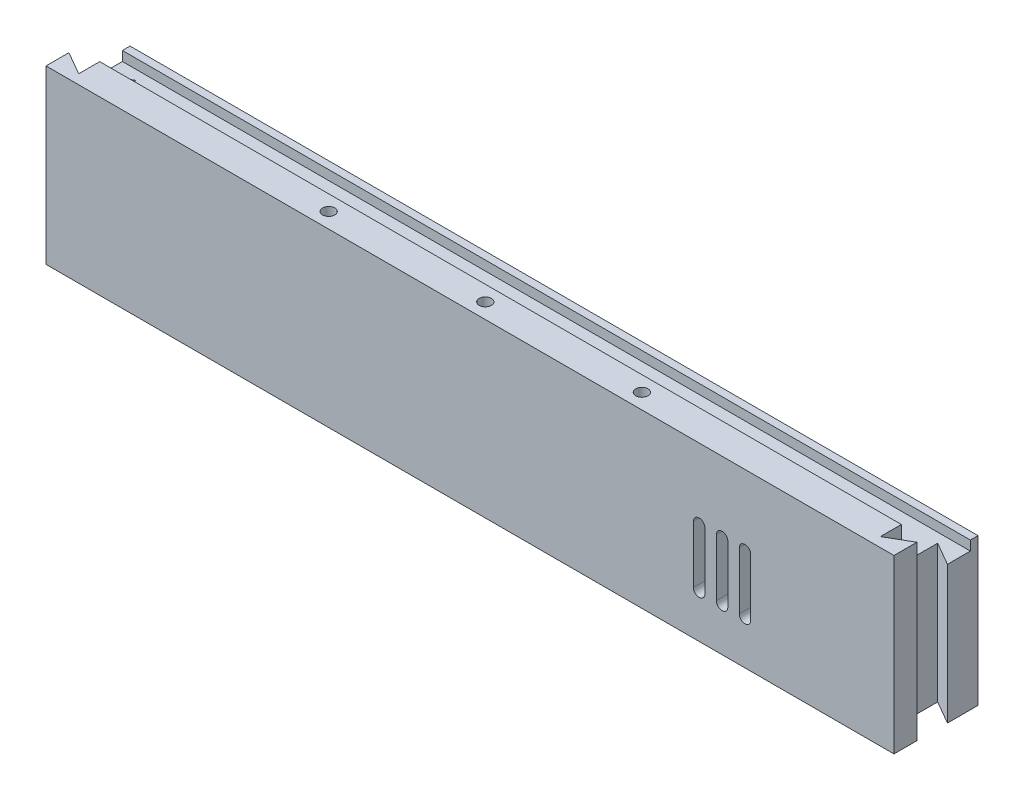
ISO-10303-21;
HEADER;
FILE_DESCRIPTION(('STEP AP214'),'2;1');
FILE_NAME('part.step','',(''),(''),'','','');
FILE_SCHEMA(('AUTOMOTIVE_DESIGN { 1 0 10303 214 1 1 1 1 }'));
ENDSEC;
DATA;
#1=APPLICATION_CONTEXT('core data for automotive mechanical design processes');
#2=APPLICATION_PROTOCOL_DEFINITION('international standard','automotive_design',2000,#1);
#3=PRODUCT_CONTEXT('',#1,'mechanical');
#4=PRODUCT('Part','Part','',(#3));
#5=PRODUCT_RELATED_PRODUCT_CATEGORY('part','',(#4));
#6=PRODUCT_DEFINITION_FORMATION('','',#4);
#7=PRODUCT_DEFINITION_CONTEXT('part definition',#1,'design');
#8=PRODUCT_DEFINITION('design','',#6,#7);
#9=PRODUCT_DEFINITION_SHAPE('','',#8);
#10=(LENGTH_UNIT() NAMED_UNIT(*) SI_UNIT(.MILLI.,.METRE.));
#11=(NAMED_UNIT(*) PLANE_ANGLE_UNIT() SI_UNIT($,.RADIAN.));
#12=(NAMED_UNIT(*) SI_UNIT($,.STERADIAN.) SOLID_ANGLE_UNIT());
#13=UNCERTAINTY_MEASURE_WITH_UNIT(LENGTH_MEASURE(1.E-05),#10,'distance_accuracy_value','');
#14=(GEOMETRIC_REPRESENTATION_CONTEXT(3) GLOBAL_UNCERTAINTY_ASSIGNED_CONTEXT((#13)) GLOBAL_UNIT_ASSIGNED_CONTEXT((#10,
#11,#12)) REPRESENTATION_CONTEXT('',''));
#15=CARTESIAN_POINT('',(0.,0.,0.));
#16=DIRECTION('',(0.,0.,1.));
#17=DIRECTION('',(1.,0.,0.));
#18=AXIS2_PLACEMENT_3D('',#15,#16,#17);
#19=CARTESIAN_POINT('',(0.,0.,0.));
#20=DIRECTION('',(0.,1.,0.));
#21=DIRECTION('',(0.,0.,1.));
#22=AXIS2_PLACEMENT_3D('',#19,#20,#21);
#23=PLANE('',#22);
#24=CARTESIAN_POINT('',(125.,0.,4.));
#25=DIRECTION('',(0.,1.,0.));
#26=DIRECTION('',(0.,0.,1.));
#27=AXIS2_PLACEMENT_3D('',#24,#25,#26);
#28=CIRCLE('',#27,1.59999999999999);
#29=CARTESIAN_POINT('',(125.,0.,5.59999999999999));
#30=VERTEX_POINT('',#29);
#31=EDGE_CURVE('E319',#30,#30,#28,.T.);
#32=ORIENTED_EDGE('',*,*,#31,.T.);
#33=EDGE_LOOP('',(#32));
#34=FACE_BOUND('',#33,.T.);
#35=DIRECTION('',(-1.,0.,0.));
#36=VECTOR('',#35,1.);
#37=CARTESIAN_POINT('',(14.,0.,-14.));
#38=LINE('',#37,#36);
#39=CARTESIAN_POINT('',(176.,0.,-14.));
#40=VERTEX_POINT('',#39);
#41=CARTESIAN_POINT('',(14.,0.,-14.));
#42=VERTEX_POINT('',#41);
#43=EDGE_CURVE('E556',#40,#42,#38,.T.);
#44=ORIENTED_EDGE('',*,*,#43,.F.);
#45=DIRECTION('',(0.,0.,-1.));
#46=VECTOR('',#45,1.);
#47=CARTESIAN_POINT('',(176.,0.,-8.));
#48=LINE('',#47,#46);
#49=CARTESIAN_POINT('',(176.,0.,-8.));
#50=VERTEX_POINT('',#49);
#51=EDGE_CURVE('E392',#50,#40,#48,.T.);
#52=ORIENTED_EDGE('',*,*,#51,.F.);
#53=DIRECTION('',(-1.,0.,0.));
#54=VECTOR('',#53,1.);
#55=CARTESIAN_POINT('',(206.,0.,-8.));
#56=LINE('',#55,#54);
#57=CARTESIAN_POINT('',(206.,0.,-8.));
#58=VERTEX_POINT('',#57);
#59=EDGE_CURVE('E407',#58,#50,#56,.T.);
#60=ORIENTED_EDGE('',*,*,#59,.F.);
#61=DIRECTION('',(0.,0.,1.));
#62=VECTOR('',#61,1.);
#63=CARTESIAN_POINT('',(206.,0.,-14.));
#64=LINE('',#63,#62);
#65=CARTESIAN_POINT('',(206.,0.,-14.));
#66=VERTEX_POINT('',#65);
#67=EDGE_CURVE('E386',#66,#58,#64,.T.);
#68=ORIENTED_EDGE('',*,*,#67,.F.);
#69=CARTESIAN_POINT('',(236.,0.,-14.));
#70=VERTEX_POINT('',#69);
#71=EDGE_CURVE('E557',#70,#66,#38,.T.);
#72=ORIENTED_EDGE('',*,*,#71,.F.);
#73=DIRECTION('',(0.,0.,1.));
#74=VECTOR('',#73,1.);
#75=CARTESIAN_POINT('',(236.,0.,0.));
#76=LINE('',#75,#74);
#77=CARTESIAN_POINT('',(236.,0.,-6.00000000000012));
#78=VERTEX_POINT('',#77);
#79=EDGE_CURVE('E456',#70,#78,#76,.T.);
#80=ORIENTED_EDGE('',*,*,#79,.T.);
#81=DIRECTION('',(0.866025403784441,0.,0.499999999999996));
#82=VECTOR('',#81,1.);
#83=CARTESIAN_POINT('',(61.5980762113523,0.,-106.690997646563));
#84=LINE('',#83,#82);
#85=CARTESIAN_POINT('',(229.937822173509,0.,-9.5000000000001));
#86=VERTEX_POINT('',#85);
#87=EDGE_CURVE('E486',#86,#78,#84,.T.);
#88=ORIENTED_EDGE('',*,*,#87,.F.);
#89=DIRECTION('',(0.,0.,-1.));
#90=VECTOR('',#89,1.);
#91=CARTESIAN_POINT('',(229.937822173509,0.,-4.25470440681991E-13));
#92=LINE('',#91,#90);
#93=CARTESIAN_POINT('',(229.937822173509,0.,5.49999999999989));
#94=VERTEX_POINT('',#93);
#95=EDGE_CURVE('E482',#94,#86,#92,.T.);
#96=ORIENTED_EDGE('',*,*,#95,.F.);
#97=DIRECTION('',(-0.866025403784439,0.,0.499999999999999));
#98=VECTOR('',#97,1.);
#99=CARTESIAN_POINT('',(59.8660254037842,0.,103.690997646564));
#100=LINE('',#99,#98);
#101=CARTESIAN_POINT('',(236.,0.,1.99999999999989));
#102=VERTEX_POINT('',#101);
#103=EDGE_CURVE('E478',#102,#94,#100,.T.);
#104=ORIENTED_EDGE('',*,*,#103,.F.);
#105=CARTESIAN_POINT('',(236.,0.,8.));
#106=VERTEX_POINT('',#105);
#107=EDGE_CURVE('E461',#102,#106,#76,.T.);
#108=ORIENTED_EDGE('',*,*,#107,.T.);
#109=DIRECTION('',(-1.,0.,0.));
#110=VECTOR('',#109,1.);
#111=CARTESIAN_POINT('',(0.,0.,7.99999999999999));
#112=LINE('',#111,#110);
#113=CARTESIAN_POINT('',(14.,0.,7.99999999999999));
#114=VERTEX_POINT('',#113);
#115=EDGE_CURVE('E448',#106,#114,#112,.T.);
#116=ORIENTED_EDGE('',*,*,#115,.T.);
#117=DIRECTION('',(0.,0.,1.));
#118=VECTOR('',#117,1.);
#119=CARTESIAN_POINT('',(14.,0.,0.));
#120=LINE('',#119,#118);
#121=CARTESIAN_POINT('',(14.,0.,2.));
#122=VERTEX_POINT('',#121);
#123=EDGE_CURVE('E466',#122,#114,#120,.T.);
#124=ORIENTED_EDGE('',*,*,#123,.F.);
#125=DIRECTION('',(0.86602540378444,0.,0.499999999999998));
#126=VECTOR('',#125,1.);
#127=CARTESIAN_POINT('',(2.63397459621554,0.,-4.56217782649105));
#128=LINE('',#127,#126);
#129=CARTESIAN_POINT('',(20.0621778264911,0.,5.5));
#130=VERTEX_POINT('',#129);
#131=EDGE_CURVE('E474',#122,#130,#128,.T.);
#132=ORIENTED_EDGE('',*,*,#131,.T.);
#133=DIRECTION('',(0.,0.,-1.));
#134=VECTOR('',#133,1.);
#135=CARTESIAN_POINT('',(20.0621778264911,0.,0.));
#136=LINE('',#135,#134);
#137=CARTESIAN_POINT('',(20.0621778264911,0.,-9.5));
#138=VERTEX_POINT('',#137);
#139=EDGE_CURVE('E470',#130,#138,#136,.T.);
#140=ORIENTED_EDGE('',*,*,#139,.T.);
#141=DIRECTION('',(-0.86602540378444,0.,0.499999999999997));
#142=VECTOR('',#141,1.);
#143=CARTESIAN_POINT('',(0.901923788646657,0.,1.56217782649103));
#144=LINE('',#143,#142);
#145=CARTESIAN_POINT('',(14.,0.,-6.));
#146=VERTEX_POINT('',#145);
#147=EDGE_CURVE('E465',#138,#146,#144,.T.);
#148=ORIENTED_EDGE('',*,*,#147,.T.);
#149=EDGE_CURVE('E460',#42,#146,#120,.T.);
#150=ORIENTED_EDGE('',*,*,#149,.F.);
#151=EDGE_LOOP('',(#44,#52,#60,#68,#72,#80,#88,#96,#104,#108,#116,#124,#132,#140,#148,#150));
#152=FACE_BOUND('',#151,.T.);
#153=CARTESIAN_POINT('',(84.,0.,4.));
#154=DIRECTION('',(0.,1.,0.));
#155=DIRECTION('',(0.,0.,1.));
#156=AXIS2_PLACEMENT_3D('',#153,#154,#155);
#157=CIRCLE('',#156,1.59999999999999);
#158=CARTESIAN_POINT('',(84.,0.,5.59999999999999));
#159=VERTEX_POINT('',#158);
#160=EDGE_CURVE('E430',#159,#159,#157,.F.);
#161=ORIENTED_EDGE('',*,*,#160,.F.);
#162=EDGE_LOOP('',(#161));
#163=FACE_BOUND('',#162,.T.);
#164=CARTESIAN_POINT('',(166.,0.,4.));
#165=DIRECTION('',(0.,1.,0.));
#166=DIRECTION('',(0.,0.,1.));
#167=AXIS2_PLACEMENT_3D('',#164,#165,#166);
#168=CIRCLE('',#167,1.59999999999999);
#169=CARTESIAN_POINT('',(166.,0.,5.59999999999999));
#170=VERTEX_POINT('',#169);
#171=EDGE_CURVE('E437',#170,#170,#168,.T.);
#172=ORIENTED_EDGE('',*,*,#171,.T.);
#173=EDGE_LOOP('',(#172));
#174=FACE_BOUND('',#173,.T.);
#175=ADVANCED_FACE('F40',(#34,#152,#163,#174),#23,.F.);
#176=CARTESIAN_POINT('',(0.,45.,0.));
#177=DIRECTION('',(0.,1.,0.));
#178=DIRECTION('',(0.,0.,1.));
#179=AXIS2_PLACEMENT_3D('',#176,#177,#178);
#180=PLANE('',#179);
#181=CARTESIAN_POINT('',(125.,45.,4.));
#182=DIRECTION('',(0.,1.,0.));
#183=DIRECTION('',(0.,0.,1.));
#184=AXIS2_PLACEMENT_3D('',#181,#182,#183);
#185=CIRCLE('',#184,1.59999999999999);
#186=CARTESIAN_POINT('',(125.,45.,5.59999999999999));
#187=VERTEX_POINT('',#186);
#188=EDGE_CURVE('E1031',#187,#187,#185,.T.);
#189=ORIENTED_EDGE('',*,*,#188,.F.);
#190=EDGE_LOOP('',(#189));
#191=FACE_BOUND('',#190,.T.);
#192=CARTESIAN_POINT('',(84.,45.,4.));
#193=DIRECTION('',(0.,1.,0.));
#194=DIRECTION('',(0.,0.,1.));
#195=AXIS2_PLACEMENT_3D('',#192,#193,#194);
#196=CIRCLE('',#195,1.59999999999999);
#197=CARTESIAN_POINT('',(84.,45.,5.59999999999999));
#198=VERTEX_POINT('',#197);
#199=EDGE_CURVE('E417',#198,#198,#196,.F.);
#200=ORIENTED_EDGE('',*,*,#199,.T.);
#201=EDGE_LOOP('',(#200));
#202=FACE_BOUND('',#201,.T.);
#203=DIRECTION('',(-1.,0.,0.));
#204=VECTOR('',#203,1.);
#205=CARTESIAN_POINT('',(0.,45.,7.99999999999999));
#206=LINE('',#205,#204);
#207=CARTESIAN_POINT('',(236.,45.,7.99999999999999));
#208=VERTEX_POINT('',#207);
#209=CARTESIAN_POINT('',(14.,45.,7.99999999999999));
#210=VERTEX_POINT('',#209);
#211=EDGE_CURVE('E441',#208,#210,#206,.T.);
#212=ORIENTED_EDGE('',*,*,#211,.F.);
#213=DIRECTION('',(0.,0.,-1.));
#214=VECTOR('',#213,1.);
#215=CARTESIAN_POINT('',(236.,45.,0.));
#216=LINE('',#215,#214);
#217=CARTESIAN_POINT('',(236.,45.,1.99999999999989));
#218=VERTEX_POINT('',#217);
#219=EDGE_CURVE('E545',#208,#218,#216,.T.);
#220=ORIENTED_EDGE('',*,*,#219,.T.);
#221=DIRECTION('',(0.866025403784439,0.,-0.499999999999999));
#222=VECTOR('',#221,1.);
#223=CARTESIAN_POINT('',(59.8660254037842,45.,103.690997646564));
#224=LINE('',#223,#222);
#225=CARTESIAN_POINT('',(229.937822173509,45.,5.49999999999989));
#226=VERTEX_POINT('',#225);
#227=EDGE_CURVE('E552',#226,#218,#224,.T.);
#228=ORIENTED_EDGE('',*,*,#227,.F.);
#229=DIRECTION('',(0.,0.,1.));
#230=VECTOR('',#229,1.);
#231=CARTESIAN_POINT('',(229.937822173509,45.,-4.25470440681991E-13));
#232=LINE('',#231,#230);
#233=CARTESIAN_POINT('',(229.937822173509,45.,0.));
#234=VERTEX_POINT('',#233);
#235=EDGE_CURVE('E532',#234,#226,#232,.T.);
#236=ORIENTED_EDGE('',*,*,#235,.F.);
#237=DIRECTION('',(1.,0.,0.));
#238=VECTOR('',#237,1.);
#239=CARTESIAN_POINT('',(0.,45.,0.));
#240=LINE('',#239,#238);
#241=CARTESIAN_POINT('',(20.0621778264911,45.,0.));
#242=VERTEX_POINT('',#241);
#243=EDGE_CURVE('E577',#242,#234,#240,.T.);
#244=ORIENTED_EDGE('',*,*,#243,.F.);
#245=DIRECTION('',(0.,0.,1.));
#246=VECTOR('',#245,1.);
#247=CARTESIAN_POINT('',(20.0621778264911,45.,0.));
#248=LINE('',#247,#246);
#249=CARTESIAN_POINT('',(20.0621778264911,45.,5.5));
#250=VERTEX_POINT('',#249);
#251=EDGE_CURVE('E525',#242,#250,#248,.T.);
#252=ORIENTED_EDGE('',*,*,#251,.T.);
#253=DIRECTION('',(-0.86602540378444,0.,-0.499999999999998));
#254=VECTOR('',#253,1.);
#255=CARTESIAN_POINT('',(2.63397459621554,45.,-4.56217782649105));
#256=LINE('',#255,#254);
#257=CARTESIAN_POINT('',(14.,45.,2.));
#258=VERTEX_POINT('',#257);
#259=EDGE_CURVE('E548',#250,#258,#256,.T.);
#260=ORIENTED_EDGE('',*,*,#259,.T.);
#261=DIRECTION('',(0.,0.,-1.));
#262=VECTOR('',#261,1.);
#263=CARTESIAN_POINT('',(14.,45.,0.));
#264=LINE('',#263,#262);
#265=EDGE_CURVE('E542',#210,#258,#264,.T.);
#266=ORIENTED_EDGE('',*,*,#265,.F.);
#267=EDGE_LOOP('',(#212,#220,#228,#236,#244,#252,#260,#266));
#268=FACE_BOUND('',#267,.T.);
#269=CARTESIAN_POINT('',(166.,45.,4.));
#270=DIRECTION('',(0.,1.,0.));
#271=DIRECTION('',(0.,0.,1.));
#272=AXIS2_PLACEMENT_3D('',#269,#270,#271);
#273=CIRCLE('',#272,1.59999999999999);
#274=CARTESIAN_POINT('',(166.,45.,5.59999999999999));
#275=VERTEX_POINT('',#274);
#276=EDGE_CURVE('E426',#275,#275,#273,.T.);
#277=ORIENTED_EDGE('',*,*,#276,.F.);
#278=EDGE_LOOP('',(#277));
#279=FACE_BOUND('',#278,.T.);
#280=ADVANCED_FACE('F674',(#191,#202,#268,#279),#180,.T.);
#281=CARTESIAN_POINT('',(0.,38.5,0.));
#282=DIRECTION('',(0.,-1.,0.));
#283=DIRECTION('',(0.,0.,-1.));
#284=AXIS2_PLACEMENT_3D('',#281,#282,#283);
#285=PLANE('',#284);
#286=DIRECTION('',(0.,0.,1.));
#287=VECTOR('',#286,1.);
#288=CARTESIAN_POINT('',(236.,38.5,0.));
#289=LINE('',#288,#287);
#290=CARTESIAN_POINT('',(236.,38.5,-14.));
#291=VERTEX_POINT('',#290);
#292=CARTESIAN_POINT('',(236.,38.5,-12.));
#293=VERTEX_POINT('',#292);
#294=EDGE_CURVE('E539',#291,#293,#289,.T.);
#295=ORIENTED_EDGE('',*,*,#294,.F.);
#296=DIRECTION('',(1.,0.,0.));
#297=VECTOR('',#296,1.);
#298=CARTESIAN_POINT('',(14.,38.5,-14.));
#299=LINE('',#298,#297);
#300=CARTESIAN_POINT('',(14.,38.5,-14.));
#301=VERTEX_POINT('',#300);
#302=EDGE_CURVE('E566',#301,#291,#299,.T.);
#303=ORIENTED_EDGE('',*,*,#302,.F.);
#304=DIRECTION('',(0.,0.,1.));
#305=VECTOR('',#304,1.);
#306=CARTESIAN_POINT('',(14.,38.5,0.));
#307=LINE('',#306,#305);
#308=CARTESIAN_POINT('',(14.,38.5,-12.));
#309=VERTEX_POINT('',#308);
#310=EDGE_CURVE('E517',#301,#309,#307,.T.);
#311=ORIENTED_EDGE('',*,*,#310,.T.);
#312=DIRECTION('',(1.,0.,0.));
#313=VECTOR('',#312,1.);
#314=CARTESIAN_POINT('',(0.,38.5,-12.));
#315=LINE('',#314,#313);
#316=EDGE_CURVE('E561',#309,#293,#315,.T.);
#317=ORIENTED_EDGE('',*,*,#316,.T.);
#318=EDGE_LOOP('',(#295,#303,#311,#317));
#319=FACE_BOUND('',#318,.T.);
#320=ADVANCED_FACE('F622',(#319),#285,.F.);
#321=CARTESIAN_POINT('',(0.,45.,0.));
#322=DIRECTION('',(0.,0.,-1.));
#323=DIRECTION('',(-1.,0.,0.));
#324=AXIS2_PLACEMENT_3D('',#321,#322,#323);
#325=PLANE('',#324);
#326=DIRECTION('',(0.,1.,0.));
#327=VECTOR('',#326,1.);
#328=CARTESIAN_POINT('',(229.937822173509,45.,0.));
#329=LINE('',#328,#327);
#330=CARTESIAN_POINT('',(229.937822173509,36.,0.));
#331=VERTEX_POINT('',#330);
#332=EDGE_CURVE('E529',#331,#234,#329,.T.);
#333=ORIENTED_EDGE('',*,*,#332,.F.);
#334=DIRECTION('',(1.,0.,0.));
#335=VECTOR('',#334,1.);
#336=CARTESIAN_POINT('',(20.0621778264911,36.,0.));
#337=LINE('',#336,#335);
#338=CARTESIAN_POINT('',(20.0621778264911,36.,0.));
#339=VERTEX_POINT('',#338);
#340=EDGE_CURVE('E452',#339,#331,#337,.T.);
#341=ORIENTED_EDGE('',*,*,#340,.F.);
#342=DIRECTION('',(0.,1.,0.));
#343=VECTOR('',#342,1.);
#344=CARTESIAN_POINT('',(20.0621778264911,45.,0.));
#345=LINE('',#344,#343);
#346=EDGE_CURVE('E521',#339,#242,#345,.T.);
#347=ORIENTED_EDGE('',*,*,#346,.T.);
#348=ORIENTED_EDGE('',*,*,#243,.T.);
#349=EDGE_LOOP('',(#333,#341,#347,#348));
#350=FACE_BOUND('',#349,.T.);
#351=ADVANCED_FACE('F42',(#350),#325,.T.);
#352=CARTESIAN_POINT('',(0.,36.,-12.));
#353=DIRECTION('',(0.,0.,1.));
#354=DIRECTION('',(1.,0.,0.));
#355=AXIS2_PLACEMENT_3D('',#352,#353,#354);
#356=PLANE('',#355);
#357=DIRECTION('',(1.,0.,0.));
#358=VECTOR('',#357,1.);
#359=CARTESIAN_POINT('',(0.,36.,-12.));
#360=LINE('',#359,#358);
#361=CARTESIAN_POINT('',(14.,36.,-12.));
#362=VERTEX_POINT('',#361);
#363=CARTESIAN_POINT('',(236.,36.,-12.));
#364=VERTEX_POINT('',#363);
#365=EDGE_CURVE('E562',#362,#364,#360,.T.);
#366=ORIENTED_EDGE('',*,*,#365,.T.);
#367=DIRECTION('',(0.,1.,0.));
#368=VECTOR('',#367,1.);
#369=CARTESIAN_POINT('',(236.,36.,-12.));
#370=LINE('',#369,#368);
#371=EDGE_CURVE('E535',#364,#293,#370,.T.);
#372=ORIENTED_EDGE('',*,*,#371,.T.);
#373=ORIENTED_EDGE('',*,*,#316,.F.);
#374=DIRECTION('',(0.,1.,0.));
#375=VECTOR('',#374,1.);
#376=CARTESIAN_POINT('',(14.,36.,-12.));
#377=LINE('',#376,#375);
#378=EDGE_CURVE('E494',#362,#309,#377,.T.);
#379=ORIENTED_EDGE('',*,*,#378,.F.);
#380=EDGE_LOOP('',(#366,#372,#373,#379));
#381=FACE_BOUND('',#380,.T.);
#382=ADVANCED_FACE('F614',(#381),#356,.T.);
#383=CARTESIAN_POINT('',(0.,36.,0.));
#384=DIRECTION('',(0.,1.,0.));
#385=DIRECTION('',(0.,0.,1.));
#386=AXIS2_PLACEMENT_3D('',#383,#384,#385);
#387=PLANE('',#386);
#388=DIRECTION('',(-0.866025403784441,0.,-0.499999999999996));
#389=VECTOR('',#388,1.);
#390=CARTESIAN_POINT('',(61.5980762113523,36.,-106.690997646563));
#391=LINE('',#390,#389);
#392=CARTESIAN_POINT('',(236.,36.,-6.00000000000012));
#393=VERTEX_POINT('',#392);
#394=CARTESIAN_POINT('',(229.937822173509,36.,-9.5000000000001));
#395=VERTEX_POINT('',#394);
#396=EDGE_CURVE('E599',#393,#395,#391,.T.);
#397=ORIENTED_EDGE('',*,*,#396,.F.);
#398=DIRECTION('',(0.,0.,-1.));
#399=VECTOR('',#398,1.);
#400=CARTESIAN_POINT('',(236.,36.,0.));
#401=LINE('',#400,#399);
#402=EDGE_CURVE('E49',#393,#364,#401,.T.);
#403=ORIENTED_EDGE('',*,*,#402,.T.);
#404=ORIENTED_EDGE('',*,*,#365,.F.);
#405=DIRECTION('',(0.,0.,-1.));
#406=VECTOR('',#405,1.);
#407=CARTESIAN_POINT('',(14.,36.,0.));
#408=LINE('',#407,#406);
#409=CARTESIAN_POINT('',(14.,36.,-6.));
#410=VERTEX_POINT('',#409);
#411=EDGE_CURVE('E584',#410,#362,#408,.T.);
#412=ORIENTED_EDGE('',*,*,#411,.F.);
#413=DIRECTION('',(0.86602540378444,0.,-0.499999999999997));
#414=VECTOR('',#413,1.);
#415=CARTESIAN_POINT('',(0.901923788646657,36.,1.56217782649103));
#416=LINE('',#415,#414);
#417=CARTESIAN_POINT('',(20.0621778264911,36.,-9.5));
#418=VERTEX_POINT('',#417);
#419=EDGE_CURVE('E587',#410,#418,#416,.T.);
#420=ORIENTED_EDGE('',*,*,#419,.T.);
#421=DIRECTION('',(0.,0.,1.));
#422=VECTOR('',#421,1.);
#423=CARTESIAN_POINT('',(20.0621778264911,36.,0.));
#424=LINE('',#423,#422);
#425=EDGE_CURVE('E591',#418,#339,#424,.T.);
#426=ORIENTED_EDGE('',*,*,#425,.T.);
#427=ORIENTED_EDGE('',*,*,#340,.T.);
#428=DIRECTION('',(0.,0.,1.));
#429=VECTOR('',#428,1.);
#430=CARTESIAN_POINT('',(229.937822173509,36.,-4.25470440681991E-13));
#431=LINE('',#430,#429);
#432=EDGE_CURVE('E595',#395,#331,#431,.T.);
#433=ORIENTED_EDGE('',*,*,#432,.F.);
#434=EDGE_LOOP('',(#397,#403,#404,#412,#420,#426,#427,#433));
#435=FACE_BOUND('',#434,.T.);
#436=ADVANCED_FACE('F607',(#435),#387,.T.);
#437=CARTESIAN_POINT('',(14.,33.5,-14.));
#438=DIRECTION('',(0.,0.,1.));
#439=DIRECTION('',(1.,0.,0.));
#440=AXIS2_PLACEMENT_3D('',#437,#438,#439);
#441=PLANE('',#440);
#442=DIRECTION('',(1.,0.,0.));
#443=VECTOR('',#442,1.);
#444=CARTESIAN_POINT('',(206.,30.,-14.));
#445=LINE('',#444,#443);
#446=CARTESIAN_POINT('',(176.,30.,-14.));
#447=VERTEX_POINT('',#446);
#448=CARTESIAN_POINT('',(206.,30.,-14.));
#449=VERTEX_POINT('',#448);
#450=EDGE_CURVE('E387',#447,#449,#445,.T.);
#451=ORIENTED_EDGE('',*,*,#450,.F.);
#452=DIRECTION('',(0.,-1.,0.));
#453=VECTOR('',#452,1.);
#454=CARTESIAN_POINT('',(176.,30.,-14.));
#455=LINE('',#454,#453);
#456=EDGE_CURVE('E413',#447,#40,#455,.T.);
#457=ORIENTED_EDGE('',*,*,#456,.T.);
#458=ORIENTED_EDGE('',*,*,#43,.T.);
#459=DIRECTION('',(0.,1.,0.));
#460=VECTOR('',#459,1.);
#461=CARTESIAN_POINT('',(14.,33.5,-14.));
#462=LINE('',#461,#460);
#463=EDGE_CURVE('E573',#42,#301,#462,.T.);
#464=ORIENTED_EDGE('',*,*,#463,.T.);
#465=ORIENTED_EDGE('',*,*,#302,.T.);
#466=DIRECTION('',(0.,1.,0.));
#467=VECTOR('',#466,1.);
#468=CARTESIAN_POINT('',(236.,33.5,-14.));
#469=LINE('',#468,#467);
#470=EDGE_CURVE('E574',#70,#291,#469,.T.);
#471=ORIENTED_EDGE('',*,*,#470,.F.);
#472=ORIENTED_EDGE('',*,*,#71,.T.);
#473=DIRECTION('',(0.,-1.,0.));
#474=VECTOR('',#473,1.);
#475=CARTESIAN_POINT('',(206.,30.,-14.));
#476=LINE('',#475,#474);
#477=EDGE_CURVE('E403',#449,#66,#476,.T.);
#478=ORIENTED_EDGE('',*,*,#477,.F.);
#479=EDGE_LOOP('',(#451,#457,#458,#464,#465,#471,#472,#478));
#480=FACE_BOUND('',#479,.T.);
#481=ADVANCED_FACE('F626',(#480),#441,.F.);
#482=CARTESIAN_POINT('',(14.,126.5,0.));
#483=DIRECTION('',(1.,0.,0.));
#484=DIRECTION('',(0.,0.,-1.));
#485=AXIS2_PLACEMENT_3D('',#482,#483,#484);
#486=PLANE('',#485);
#487=ORIENTED_EDGE('',*,*,#123,.T.);
#488=DIRECTION('',(0.,1.,0.));
#489=VECTOR('',#488,1.);
#490=CARTESIAN_POINT('',(14.,-15.5,7.99999999999999));
#491=LINE('',#490,#489);
#492=EDGE_CURVE('E444',#114,#210,#491,.T.);
#493=ORIENTED_EDGE('',*,*,#492,.T.);
#494=ORIENTED_EDGE('',*,*,#265,.T.);
#495=DIRECTION('',(0.,-1.,0.));
#496=VECTOR('',#495,1.);
#497=CARTESIAN_POINT('',(14.,126.5,2.));
#498=LINE('',#497,#496);
#499=EDGE_CURVE('E504',#258,#122,#498,.T.);
#500=ORIENTED_EDGE('',*,*,#499,.T.);
#501=EDGE_LOOP('',(#487,#493,#494,#500));
#502=FACE_BOUND('',#501,.T.);
#503=ADVANCED_FACE('F688',(#502),#486,.F.);
#504=ORIENTED_EDGE('',*,*,#149,.T.);
#505=DIRECTION('',(0.,-1.,0.));
#506=VECTOR('',#505,1.);
#507=CARTESIAN_POINT('',(14.,126.5,-6.));
#508=LINE('',#507,#506);
#509=EDGE_CURVE('E490',#410,#146,#508,.T.);
#510=ORIENTED_EDGE('',*,*,#509,.F.);
#511=ORIENTED_EDGE('',*,*,#411,.T.);
#512=ORIENTED_EDGE('',*,*,#378,.T.);
#513=ORIENTED_EDGE('',*,*,#310,.F.);
#514=ORIENTED_EDGE('',*,*,#463,.F.);
#515=EDGE_LOOP('',(#504,#510,#511,#512,#513,#514));
#516=FACE_BOUND('',#515,.T.);
#517=ADVANCED_FACE('F617',(#516),#486,.F.);
#518=CARTESIAN_POINT('',(0.901923788646657,126.5,1.56217782649103));
#519=DIRECTION('',(0.499999999999997,0.,0.86602540378444));
#520=DIRECTION('',(0.86602540378444,0.,-0.499999999999997));
#521=AXIS2_PLACEMENT_3D('',#518,#519,#520);
#522=PLANE('',#521);
#523=ORIENTED_EDGE('',*,*,#509,.T.);
#524=ORIENTED_EDGE('',*,*,#147,.F.);
#525=DIRECTION('',(0.,-1.,0.));
#526=VECTOR('',#525,1.);
#527=CARTESIAN_POINT('',(20.0621778264911,126.5,-9.5));
#528=LINE('',#527,#526);
#529=EDGE_CURVE('E510',#418,#138,#528,.T.);
#530=ORIENTED_EDGE('',*,*,#529,.F.);
#531=ORIENTED_EDGE('',*,*,#419,.F.);
#532=EDGE_LOOP('',(#523,#524,#530,#531));
#533=FACE_BOUND('',#532,.T.);
#534=ADVANCED_FACE('F637',(#533),#522,.T.);
#535=CARTESIAN_POINT('',(20.0621778264911,126.5,0.));
#536=DIRECTION('',(-1.,0.,0.));
#537=DIRECTION('',(0.,0.,1.));
#538=AXIS2_PLACEMENT_3D('',#535,#536,#537);
#539=PLANE('',#538);
#540=ORIENTED_EDGE('',*,*,#346,.F.);
#541=ORIENTED_EDGE('',*,*,#425,.F.);
#542=ORIENTED_EDGE('',*,*,#529,.T.);
#543=ORIENTED_EDGE('',*,*,#139,.F.);
#544=DIRECTION('',(0.,-1.,0.));
#545=VECTOR('',#544,1.);
#546=CARTESIAN_POINT('',(20.0621778264911,126.5,5.5));
#547=LINE('',#546,#545);
#548=EDGE_CURVE('E507',#250,#130,#547,.T.);
#549=ORIENTED_EDGE('',*,*,#548,.F.);
#550=ORIENTED_EDGE('',*,*,#251,.F.);
#551=EDGE_LOOP('',(#540,#541,#542,#543,#549,#550));
#552=FACE_BOUND('',#551,.T.);
#553=ADVANCED_FACE('F695',(#552),#539,.T.);
#554=CARTESIAN_POINT('',(2.63397459621554,126.5,-4.56217782649105));
#555=DIRECTION('',(0.499999999999998,0.,-0.86602540378444));
#556=DIRECTION('',(-0.86602540378444,0.,-0.499999999999998));
#557=AXIS2_PLACEMENT_3D('',#554,#555,#556);
#558=PLANE('',#557);
#559=ORIENTED_EDGE('',*,*,#548,.T.);
#560=ORIENTED_EDGE('',*,*,#131,.F.);
#561=ORIENTED_EDGE('',*,*,#499,.F.);
#562=ORIENTED_EDGE('',*,*,#259,.F.);
#563=EDGE_LOOP('',(#559,#560,#561,#562));
#564=FACE_BOUND('',#563,.T.);
#565=ADVANCED_FACE('F698',(#564),#558,.T.);
#566=CARTESIAN_POINT('',(236.,126.5,0.));
#567=DIRECTION('',(1.,0.,0.));
#568=DIRECTION('',(0.,0.,-1.));
#569=AXIS2_PLACEMENT_3D('',#566,#567,#568);
#570=PLANE('',#569);
#571=ORIENTED_EDGE('',*,*,#470,.T.);
#572=ORIENTED_EDGE('',*,*,#294,.T.);
#573=ORIENTED_EDGE('',*,*,#371,.F.);
#574=ORIENTED_EDGE('',*,*,#402,.F.);
#575=DIRECTION('',(0.,-1.,0.));
#576=VECTOR('',#575,1.);
#577=CARTESIAN_POINT('',(236.,126.5,-6.00000000000012));
#578=LINE('',#577,#576);
#579=EDGE_CURVE('E491',#393,#78,#578,.T.);
#580=ORIENTED_EDGE('',*,*,#579,.T.);
#581=ORIENTED_EDGE('',*,*,#79,.F.);
#582=EDGE_LOOP('',(#571,#572,#573,#574,#580,#581));
#583=FACE_BOUND('',#582,.T.);
#584=ADVANCED_FACE('F650',(#583),#570,.T.);
#585=CARTESIAN_POINT('',(61.5980762113523,126.5,-106.690997646563));
#586=DIRECTION('',(0.499999999999996,0.,-0.866025403784441));
#587=DIRECTION('',(-0.866025403784441,0.,-0.499999999999996));
#588=AXIS2_PLACEMENT_3D('',#585,#586,#587);
#589=PLANE('',#588);
#590=ORIENTED_EDGE('',*,*,#396,.T.);
#591=DIRECTION('',(0.,-1.,0.));
#592=VECTOR('',#591,1.);
#593=CARTESIAN_POINT('',(229.937822173509,126.5,-9.5000000000001));
#594=LINE('',#593,#592);
#595=EDGE_CURVE('E495',#395,#86,#594,.T.);
#596=ORIENTED_EDGE('',*,*,#595,.T.);
#597=ORIENTED_EDGE('',*,*,#87,.T.);
#598=ORIENTED_EDGE('',*,*,#579,.F.);
#599=EDGE_LOOP('',(#590,#596,#597,#598));
#600=FACE_BOUND('',#599,.T.);
#601=ADVANCED_FACE('F649',(#600),#589,.F.);
#602=CARTESIAN_POINT('',(229.937822173509,126.5,-4.25470440681991E-13));
#603=DIRECTION('',(-1.,0.,0.));
#604=DIRECTION('',(0.,0.,1.));
#605=AXIS2_PLACEMENT_3D('',#602,#603,#604);
#606=PLANE('',#605);
#607=ORIENTED_EDGE('',*,*,#432,.T.);
#608=ORIENTED_EDGE('',*,*,#332,.T.);
#609=ORIENTED_EDGE('',*,*,#235,.T.);
#610=DIRECTION('',(0.,-1.,0.));
#611=VECTOR('',#610,1.);
#612=CARTESIAN_POINT('',(229.937822173509,126.5,5.49999999999989));
#613=LINE('',#612,#611);
#614=EDGE_CURVE('E498',#226,#94,#613,.T.);
#615=ORIENTED_EDGE('',*,*,#614,.T.);
#616=ORIENTED_EDGE('',*,*,#95,.T.);
#617=ORIENTED_EDGE('',*,*,#595,.F.);
#618=EDGE_LOOP('',(#607,#608,#609,#615,#616,#617));
#619=FACE_BOUND('',#618,.T.);
#620=ADVANCED_FACE('F645',(#619),#606,.F.);
#621=CARTESIAN_POINT('',(59.8660254037842,126.5,103.690997646564));
#622=DIRECTION('',(0.499999999999999,0.,0.866025403784439));
#623=DIRECTION('',(0.866025403784439,0.,-0.499999999999999));
#624=AXIS2_PLACEMENT_3D('',#621,#622,#623);
#625=PLANE('',#624);
#626=ORIENTED_EDGE('',*,*,#227,.T.);
#627=DIRECTION('',(0.,-1.,0.));
#628=VECTOR('',#627,1.);
#629=CARTESIAN_POINT('',(236.,126.5,1.99999999999989));
#630=LINE('',#629,#628);
#631=EDGE_CURVE('E501',#218,#102,#630,.T.);
#632=ORIENTED_EDGE('',*,*,#631,.T.);
#633=ORIENTED_EDGE('',*,*,#103,.T.);
#634=ORIENTED_EDGE('',*,*,#614,.F.);
#635=EDGE_LOOP('',(#626,#632,#633,#634));
#636=FACE_BOUND('',#635,.T.);
#637=ADVANCED_FACE('F709',(#636),#625,.F.);
#638=DIRECTION('',(0.,1.,0.));
#639=VECTOR('',#638,1.);
#640=CARTESIAN_POINT('',(236.,126.5,8.));
#641=LINE('',#640,#639);
#642=EDGE_CURVE('E11',#106,#208,#641,.T.);
#643=ORIENTED_EDGE('',*,*,#642,.F.);
#644=ORIENTED_EDGE('',*,*,#107,.F.);
#645=ORIENTED_EDGE('',*,*,#631,.F.);
#646=ORIENTED_EDGE('',*,*,#219,.F.);
#647=EDGE_LOOP('',(#643,#644,#645,#646));
#648=FACE_BOUND('',#647,.T.);
#649=ADVANCED_FACE('F705',(#648),#570,.T.);
#650=CARTESIAN_POINT('',(0.,-15.5,7.99999999999999));
#651=DIRECTION('',(0.,0.,-1.));
#652=DIRECTION('',(-1.,0.,0.));
#653=AXIS2_PLACEMENT_3D('',#650,#651,#652);
#654=PLANE('',#653);
#655=CARTESIAN_POINT('',(197.,11.5,8.));
#656=DIRECTION('',(0.,0.,-1.));
#657=DIRECTION('',(-1.,0.,0.));
#658=AXIS2_PLACEMENT_3D('',#655,#656,#657);
#659=CIRCLE('',#658,1.5);
#660=CARTESIAN_POINT('',(198.5,11.5,8.));
#661=VERTEX_POINT('',#660);
#662=CARTESIAN_POINT('',(195.5,11.5,8.));
#663=VERTEX_POINT('',#662);
#664=EDGE_CURVE('E378',#661,#663,#659,.T.);
#665=ORIENTED_EDGE('',*,*,#664,.T.);
#666=DIRECTION('',(0.,1.,0.));
#667=VECTOR('',#666,1.);
#668=CARTESIAN_POINT('',(195.5,-15.5,8.));
#669=LINE('',#668,#667);
#670=CARTESIAN_POINT('',(195.5,26.5,8.));
#671=VERTEX_POINT('',#670);
#672=EDGE_CURVE('E382',#663,#671,#669,.T.);
#673=ORIENTED_EDGE('',*,*,#672,.T.);
#674=CARTESIAN_POINT('',(197.,26.5,8.));
#675=DIRECTION('',(0.,0.,-1.));
#676=DIRECTION('',(-1.,0.,0.));
#677=AXIS2_PLACEMENT_3D('',#674,#675,#676);
#678=CIRCLE('',#677,1.5);
#679=CARTESIAN_POINT('',(198.5,26.5,8.));
#680=VERTEX_POINT('',#679);
#681=EDGE_CURVE('E373',#671,#680,#678,.T.);
#682=ORIENTED_EDGE('',*,*,#681,.T.);
#683=DIRECTION('',(0.,1.,0.));
#684=VECTOR('',#683,1.);
#685=CARTESIAN_POINT('',(198.5,-15.5,8.));
#686=LINE('',#685,#684);
#687=EDGE_CURVE('E254',#661,#680,#686,.T.);
#688=ORIENTED_EDGE('',*,*,#687,.F.);
#689=EDGE_LOOP('',(#665,#673,#682,#688));
#690=FACE_BOUND('',#689,.T.);
#691=CARTESIAN_POINT('',(191.,11.5,8.));
#692=DIRECTION('',(0.,0.,-1.));
#693=DIRECTION('',(-1.,0.,0.));
#694=AXIS2_PLACEMENT_3D('',#691,#692,#693);
#695=CIRCLE('',#694,1.5);
#696=CARTESIAN_POINT('',(192.5,11.5,8.));
#697=VERTEX_POINT('',#696);
#698=CARTESIAN_POINT('',(189.5,11.5,8.));
#699=VERTEX_POINT('',#698);
#700=EDGE_CURVE('E365',#697,#699,#695,.T.);
#701=ORIENTED_EDGE('',*,*,#700,.T.);
#702=DIRECTION('',(0.,1.,0.));
#703=VECTOR('',#702,1.);
#704=CARTESIAN_POINT('',(189.5,-15.5,8.));
#705=LINE('',#704,#703);
#706=CARTESIAN_POINT('',(189.5,26.5,8.));
#707=VERTEX_POINT('',#706);
#708=EDGE_CURVE('E369',#699,#707,#705,.T.);
#709=ORIENTED_EDGE('',*,*,#708,.T.);
#710=CARTESIAN_POINT('',(191.,26.5,8.));
#711=DIRECTION('',(0.,0.,-1.));
#712=DIRECTION('',(-1.,0.,0.));
#713=AXIS2_PLACEMENT_3D('',#710,#711,#712);
#714=CIRCLE('',#713,1.5);
#715=CARTESIAN_POINT('',(192.5,26.5,8.));
#716=VERTEX_POINT('',#715);
#717=EDGE_CURVE('E358',#707,#716,#714,.T.);
#718=ORIENTED_EDGE('',*,*,#717,.T.);
#719=DIRECTION('',(0.,1.,0.));
#720=VECTOR('',#719,1.);
#721=CARTESIAN_POINT('',(192.5,-15.5,8.));
#722=LINE('',#721,#720);
#723=EDGE_CURVE('E362',#697,#716,#722,.T.);
#724=ORIENTED_EDGE('',*,*,#723,.F.);
#725=EDGE_LOOP('',(#701,#709,#718,#724));
#726=FACE_BOUND('',#725,.T.);
#727=CARTESIAN_POINT('',(185.,11.5,8.));
#728=DIRECTION('',(0.,0.,-1.));
#729=DIRECTION('',(-1.,0.,0.));
#730=AXIS2_PLACEMENT_3D('',#727,#728,#729);
#731=CIRCLE('',#730,1.5);
#732=CARTESIAN_POINT('',(186.5,11.5,8.));
#733=VERTEX_POINT('',#732);
#734=CARTESIAN_POINT('',(183.5,11.5,8.));
#735=VERTEX_POINT('',#734);
#736=EDGE_CURVE('E350',#733,#735,#731,.T.);
#737=ORIENTED_EDGE('',*,*,#736,.T.);
#738=DIRECTION('',(0.,1.,0.));
#739=VECTOR('',#738,1.);
#740=CARTESIAN_POINT('',(183.5,-15.5,8.));
#741=LINE('',#740,#739);
#742=CARTESIAN_POINT('',(183.5,26.5,8.));
#743=VERTEX_POINT('',#742);
#744=EDGE_CURVE('E354',#735,#743,#741,.T.);
#745=ORIENTED_EDGE('',*,*,#744,.T.);
#746=CARTESIAN_POINT('',(185.,26.5,8.));
#747=DIRECTION('',(0.,0.,-1.));
#748=DIRECTION('',(-1.,0.,0.));
#749=AXIS2_PLACEMENT_3D('',#746,#747,#748);
#750=CIRCLE('',#749,1.5);
#751=CARTESIAN_POINT('',(186.5,26.5,8.));
#752=VERTEX_POINT('',#751);
#753=EDGE_CURVE('E283',#743,#752,#750,.T.);
#754=ORIENTED_EDGE('',*,*,#753,.T.);
#755=DIRECTION('',(0.,1.,0.));
#756=VECTOR('',#755,1.);
#757=CARTESIAN_POINT('',(186.5,-15.5,8.));
#758=LINE('',#757,#756);
#759=EDGE_CURVE('E346',#733,#752,#758,.T.);
#760=ORIENTED_EDGE('',*,*,#759,.F.);
#761=EDGE_LOOP('',(#737,#745,#754,#760));
#762=FACE_BOUND('',#761,.T.);
#763=ORIENTED_EDGE('',*,*,#642,.T.);
#764=ORIENTED_EDGE('',*,*,#211,.T.);
#765=ORIENTED_EDGE('',*,*,#492,.F.);
#766=ORIENTED_EDGE('',*,*,#115,.F.);
#767=EDGE_LOOP('',(#763,#764,#765,#766));
#768=FACE_BOUND('',#767,.T.);
#769=ADVANCED_FACE('F708',(#690,#726,#762,#768),#654,.F.);
#770=CARTESIAN_POINT('',(84.,-15.5,4.));
#771=DIRECTION('',(0.,1.,0.));
#772=DIRECTION('',(0.,0.,1.));
#773=AXIS2_PLACEMENT_3D('',#770,#771,#772);
#774=CYLINDRICAL_SURFACE('',#773,1.59999999999999);
#775=ORIENTED_EDGE('',*,*,#199,.F.);
#776=EDGE_LOOP('',(#775));
#777=FACE_BOUND('',#776,.T.);
#778=ORIENTED_EDGE('',*,*,#160,.T.);
#779=EDGE_LOOP('',(#778));
#780=FACE_BOUND('',#779,.T.);
#781=ADVANCED_FACE('F720',(#777,#780),#774,.F.);
#782=CARTESIAN_POINT('',(166.,-15.5,4.));
#783=DIRECTION('',(0.,1.,0.));
#784=DIRECTION('',(0.,0.,1.));
#785=AXIS2_PLACEMENT_3D('',#782,#783,#784);
#786=CYLINDRICAL_SURFACE('',#785,1.59999999999999);
#787=ORIENTED_EDGE('',*,*,#276,.T.);
#788=EDGE_LOOP('',(#787));
#789=FACE_BOUND('',#788,.T.);
#790=ORIENTED_EDGE('',*,*,#171,.F.);
#791=EDGE_LOOP('',(#790));
#792=FACE_BOUND('',#791,.T.);
#793=ADVANCED_FACE('F671',(#789,#792),#786,.F.);
#794=CARTESIAN_POINT('',(176.,30.,-8.));
#795=DIRECTION('',(-1.,0.,0.));
#796=DIRECTION('',(0.,0.,1.));
#797=AXIS2_PLACEMENT_3D('',#794,#795,#796);
#798=PLANE('',#797);
#799=ORIENTED_EDGE('',*,*,#51,.T.);
#800=ORIENTED_EDGE('',*,*,#456,.F.);
#801=DIRECTION('',(0.,0.,-1.));
#802=VECTOR('',#801,1.);
#803=CARTESIAN_POINT('',(176.,30.,-8.));
#804=LINE('',#803,#802);
#805=CARTESIAN_POINT('',(176.,30.,-8.));
#806=VERTEX_POINT('',#805);
#807=EDGE_CURVE('E400',#806,#447,#804,.T.);
#808=ORIENTED_EDGE('',*,*,#807,.F.);
#809=DIRECTION('',(0.,-1.,0.));
#810=VECTOR('',#809,1.);
#811=CARTESIAN_POINT('',(176.,30.,-8.));
#812=LINE('',#811,#810);
#813=EDGE_CURVE('E418',#806,#50,#812,.T.);
#814=ORIENTED_EDGE('',*,*,#813,.T.);
#815=EDGE_LOOP('',(#799,#800,#808,#814));
#816=FACE_BOUND('',#815,.T.);
#817=ADVANCED_FACE('F662',(#816),#798,.F.);
#818=CARTESIAN_POINT('',(206.,30.,-8.));
#819=DIRECTION('',(0.,0.,1.));
#820=DIRECTION('',(1.,0.,0.));
#821=AXIS2_PLACEMENT_3D('',#818,#819,#820);
#822=PLANE('',#821);
#823=CARTESIAN_POINT('',(197.,26.5,-8.));
#824=DIRECTION('',(0.,0.,-1.));
#825=DIRECTION('',(-1.,0.,0.));
#826=AXIS2_PLACEMENT_3D('',#823,#824,#825);
#827=CIRCLE('',#826,1.5);
#828=CARTESIAN_POINT('',(195.5,26.5,-8.));
#829=VERTEX_POINT('',#828);
#830=CARTESIAN_POINT('',(198.5,26.5,-8.));
#831=VERTEX_POINT('',#830);
#832=EDGE_CURVE('E262',#829,#831,#827,.T.);
#833=ORIENTED_EDGE('',*,*,#832,.F.);
#834=DIRECTION('',(0.,1.,0.));
#835=VECTOR('',#834,1.);
#836=CARTESIAN_POINT('',(195.5,0.,-8.));
#837=LINE('',#836,#835);
#838=CARTESIAN_POINT('',(195.5,11.5,-8.));
#839=VERTEX_POINT('',#838);
#840=EDGE_CURVE('E268',#839,#829,#837,.T.);
#841=ORIENTED_EDGE('',*,*,#840,.F.);
#842=CARTESIAN_POINT('',(197.,11.5,-8.));
#843=DIRECTION('',(0.,0.,-1.));
#844=DIRECTION('',(-1.,0.,0.));
#845=AXIS2_PLACEMENT_3D('',#842,#843,#844);
#846=CIRCLE('',#845,1.5);
#847=CARTESIAN_POINT('',(198.5,11.5,-8.));
#848=VERTEX_POINT('',#847);
#849=EDGE_CURVE('E273',#848,#839,#846,.T.);
#850=ORIENTED_EDGE('',*,*,#849,.F.);
#851=DIRECTION('',(0.,1.,0.));
#852=VECTOR('',#851,1.);
#853=CARTESIAN_POINT('',(198.5,0.,-8.));
#854=LINE('',#853,#852);
#855=EDGE_CURVE('E251',#848,#831,#854,.T.);
#856=ORIENTED_EDGE('',*,*,#855,.T.);
#857=EDGE_LOOP('',(#833,#841,#850,#856));
#858=FACE_BOUND('',#857,.T.);
#859=CARTESIAN_POINT('',(191.,26.5,-8.));
#860=DIRECTION('',(0.,0.,-1.));
#861=DIRECTION('',(-1.,0.,0.));
#862=AXIS2_PLACEMENT_3D('',#859,#860,#861);
#863=CIRCLE('',#862,1.5);
#864=CARTESIAN_POINT('',(189.5,26.5,-8.));
#865=VERTEX_POINT('',#864);
#866=CARTESIAN_POINT('',(192.5,26.5,-8.));
#867=VERTEX_POINT('',#866);
#868=EDGE_CURVE('E291',#865,#867,#863,.T.);
#869=ORIENTED_EDGE('',*,*,#868,.F.);
#870=DIRECTION('',(0.,1.,0.));
#871=VECTOR('',#870,1.);
#872=CARTESIAN_POINT('',(189.5,0.,-8.));
#873=LINE('',#872,#871);
#874=CARTESIAN_POINT('',(189.5,11.5,-8.));
#875=VERTEX_POINT('',#874);
#876=EDGE_CURVE('E288',#875,#865,#873,.T.);
#877=ORIENTED_EDGE('',*,*,#876,.F.);
#878=CARTESIAN_POINT('',(191.,11.5,-8.));
#879=DIRECTION('',(0.,0.,-1.));
#880=DIRECTION('',(-1.,0.,0.));
#881=AXIS2_PLACEMENT_3D('',#878,#879,#880);
#882=CIRCLE('',#881,1.5);
#883=CARTESIAN_POINT('',(192.5,11.5,-8.));
#884=VERTEX_POINT('',#883);
#885=EDGE_CURVE('E299',#884,#875,#882,.T.);
#886=ORIENTED_EDGE('',*,*,#885,.F.);
#887=DIRECTION('',(0.,1.,0.));
#888=VECTOR('',#887,1.);
#889=CARTESIAN_POINT('',(192.5,0.,-8.));
#890=LINE('',#889,#888);
#891=EDGE_CURVE('E295',#884,#867,#890,.T.);
#892=ORIENTED_EDGE('',*,*,#891,.T.);
#893=EDGE_LOOP('',(#869,#877,#886,#892));
#894=FACE_BOUND('',#893,.T.);
#895=CARTESIAN_POINT('',(185.,26.5,-8.));
#896=DIRECTION('',(0.,0.,-1.));
#897=DIRECTION('',(-1.,0.,0.));
#898=AXIS2_PLACEMENT_3D('',#895,#896,#897);
#899=CIRCLE('',#898,1.5);
#900=CARTESIAN_POINT('',(183.5,26.5,-8.));
#901=VERTEX_POINT('',#900);
#902=CARTESIAN_POINT('',(186.5,26.5,-8.));
#903=VERTEX_POINT('',#902);
#904=EDGE_CURVE('E318',#901,#903,#899,.T.);
#905=ORIENTED_EDGE('',*,*,#904,.F.);
#906=DIRECTION('',(0.,1.,0.));
#907=VECTOR('',#906,1.);
#908=CARTESIAN_POINT('',(183.5,0.,-8.));
#909=LINE('',#908,#907);
#910=CARTESIAN_POINT('',(183.5,11.5,-8.));
#911=VERTEX_POINT('',#910);
#912=EDGE_CURVE('E315',#911,#901,#909,.T.);
#913=ORIENTED_EDGE('',*,*,#912,.F.);
#914=CARTESIAN_POINT('',(185.,11.5,-8.));
#915=DIRECTION('',(0.,0.,-1.));
#916=DIRECTION('',(-1.,0.,0.));
#917=AXIS2_PLACEMENT_3D('',#914,#915,#916);
#918=CIRCLE('',#917,1.5);
#919=CARTESIAN_POINT('',(186.5,11.5,-8.));
#920=VERTEX_POINT('',#919);
#921=EDGE_CURVE('E327',#920,#911,#918,.T.);
#922=ORIENTED_EDGE('',*,*,#921,.F.);
#923=DIRECTION('',(0.,1.,0.));
#924=VECTOR('',#923,1.);
#925=CARTESIAN_POINT('',(186.5,0.,-8.));
#926=LINE('',#925,#924);
#927=EDGE_CURVE('E323',#920,#903,#926,.T.);
#928=ORIENTED_EDGE('',*,*,#927,.T.);
#929=EDGE_LOOP('',(#905,#913,#922,#928));
#930=FACE_BOUND('',#929,.T.);
#931=ORIENTED_EDGE('',*,*,#59,.T.);
#932=ORIENTED_EDGE('',*,*,#813,.F.);
#933=DIRECTION('',(-1.,0.,0.));
#934=VECTOR('',#933,1.);
#935=CARTESIAN_POINT('',(206.,30.,-8.));
#936=LINE('',#935,#934);
#937=CARTESIAN_POINT('',(206.,30.,-8.));
#938=VERTEX_POINT('',#937);
#939=EDGE_CURVE('E396',#938,#806,#936,.T.);
#940=ORIENTED_EDGE('',*,*,#939,.F.);
#941=DIRECTION('',(0.,-1.,0.));
#942=VECTOR('',#941,1.);
#943=CARTESIAN_POINT('',(206.,30.,-8.));
#944=LINE('',#943,#942);
#945=EDGE_CURVE('E421',#938,#58,#944,.T.);
#946=ORIENTED_EDGE('',*,*,#945,.T.);
#947=EDGE_LOOP('',(#931,#932,#940,#946));
#948=FACE_BOUND('',#947,.T.);
#949=ADVANCED_FACE('F270',(#858,#894,#930,#948),#822,.F.);
#950=CARTESIAN_POINT('',(206.,30.,-14.));
#951=DIRECTION('',(1.,0.,0.));
#952=DIRECTION('',(0.,0.,-1.));
#953=AXIS2_PLACEMENT_3D('',#950,#951,#952);
#954=PLANE('',#953);
#955=ORIENTED_EDGE('',*,*,#67,.T.);
#956=ORIENTED_EDGE('',*,*,#945,.F.);
#957=DIRECTION('',(0.,0.,1.));
#958=VECTOR('',#957,1.);
#959=CARTESIAN_POINT('',(206.,30.,-14.));
#960=LINE('',#959,#958);
#961=EDGE_CURVE('E391',#449,#938,#960,.T.);
#962=ORIENTED_EDGE('',*,*,#961,.F.);
#963=ORIENTED_EDGE('',*,*,#477,.T.);
#964=EDGE_LOOP('',(#955,#956,#962,#963));
#965=FACE_BOUND('',#964,.T.);
#966=ADVANCED_FACE('F655',(#965),#954,.F.);
#967=CARTESIAN_POINT('',(0.,30.,0.));
#968=DIRECTION('',(0.,-1.,0.));
#969=DIRECTION('',(0.,0.,-1.));
#970=AXIS2_PLACEMENT_3D('',#967,#968,#969);
#971=PLANE('',#970);
#972=ORIENTED_EDGE('',*,*,#450,.T.);
#973=ORIENTED_EDGE('',*,*,#961,.T.);
#974=ORIENTED_EDGE('',*,*,#939,.T.);
#975=ORIENTED_EDGE('',*,*,#807,.T.);
#976=EDGE_LOOP('',(#972,#973,#974,#975));
#977=FACE_BOUND('',#976,.T.);
#978=ADVANCED_FACE('F658',(#977),#971,.T.);
#979=CARTESIAN_POINT('',(183.5,0.,22.));
#980=DIRECTION('',(-1.,0.,0.));
#981=DIRECTION('',(0.,0.,1.));
#982=AXIS2_PLACEMENT_3D('',#979,#980,#981);
#983=PLANE('',#982);
#984=DIRECTION('',(0.,0.,-1.));
#985=VECTOR('',#984,1.);
#986=CARTESIAN_POINT('',(183.5,11.5,22.));
#987=LINE('',#986,#985);
#988=EDGE_CURVE('E292',#735,#911,#987,.T.);
#989=ORIENTED_EDGE('',*,*,#988,.T.);
#990=ORIENTED_EDGE('',*,*,#912,.T.);
#991=DIRECTION('',(0.,0.,-1.));
#992=VECTOR('',#991,1.);
#993=CARTESIAN_POINT('',(183.5,26.5,22.));
#994=LINE('',#993,#992);
#995=EDGE_CURVE('E331',#743,#901,#994,.T.);
#996=ORIENTED_EDGE('',*,*,#995,.F.);
#997=ORIENTED_EDGE('',*,*,#744,.F.);
#998=EDGE_LOOP('',(#989,#990,#996,#997));
#999=FACE_BOUND('',#998,.T.);
#1000=ADVANCED_FACE('F758',(#999),#983,.F.);
#1001=CARTESIAN_POINT('',(185.,11.5,22.));
#1002=DIRECTION('',(0.,0.,-1.));
#1003=DIRECTION('',(-1.,0.,0.));
#1004=AXIS2_PLACEMENT_3D('',#1001,#1002,#1003);
#1005=CYLINDRICAL_SURFACE('',#1004,1.5);
#1006=DIRECTION('',(0.,0.,-1.));
#1007=VECTOR('',#1006,1.);
#1008=CARTESIAN_POINT('',(186.5,11.5,22.));
#1009=LINE('',#1008,#1007);
#1010=EDGE_CURVE('E334',#733,#920,#1009,.T.);
#1011=ORIENTED_EDGE('',*,*,#1010,.T.);
#1012=ORIENTED_EDGE('',*,*,#921,.T.);
#1013=ORIENTED_EDGE('',*,*,#988,.F.);
#1014=ORIENTED_EDGE('',*,*,#736,.F.);
#1015=EDGE_LOOP('',(#1011,#1012,#1013,#1014));
#1016=FACE_BOUND('',#1015,.T.);
#1017=ADVANCED_FACE('F778',(#1016),#1005,.F.);
#1018=CARTESIAN_POINT('',(186.5,0.,22.));
#1019=DIRECTION('',(-1.,0.,0.));
#1020=DIRECTION('',(0.,0.,1.));
#1021=AXIS2_PLACEMENT_3D('',#1018,#1019,#1020);
#1022=PLANE('',#1021);
#1023=ORIENTED_EDGE('',*,*,#759,.T.);
#1024=DIRECTION('',(0.,0.,-1.));
#1025=VECTOR('',#1024,1.);
#1026=CARTESIAN_POINT('',(186.5,26.5,22.));
#1027=LINE('',#1026,#1025);
#1028=EDGE_CURVE('E337',#752,#903,#1027,.T.);
#1029=ORIENTED_EDGE('',*,*,#1028,.T.);
#1030=ORIENTED_EDGE('',*,*,#927,.F.);
#1031=ORIENTED_EDGE('',*,*,#1010,.F.);
#1032=EDGE_LOOP('',(#1023,#1029,#1030,#1031));
#1033=FACE_BOUND('',#1032,.T.);
#1034=ADVANCED_FACE('F788',(#1033),#1022,.T.);
#1035=CARTESIAN_POINT('',(185.,26.5,22.));
#1036=DIRECTION('',(0.,0.,-1.));
#1037=DIRECTION('',(-1.,0.,0.));
#1038=AXIS2_PLACEMENT_3D('',#1035,#1036,#1037);
#1039=CYLINDRICAL_SURFACE('',#1038,1.5);
#1040=ORIENTED_EDGE('',*,*,#995,.T.);
#1041=ORIENTED_EDGE('',*,*,#904,.T.);
#1042=ORIENTED_EDGE('',*,*,#1028,.F.);
#1043=ORIENTED_EDGE('',*,*,#753,.F.);
#1044=EDGE_LOOP('',(#1040,#1041,#1042,#1043));
#1045=FACE_BOUND('',#1044,.T.);
#1046=ADVANCED_FACE('F798',(#1045),#1039,.F.);
#1047=CARTESIAN_POINT('',(189.5,0.,22.));
#1048=DIRECTION('',(-1.,0.,0.));
#1049=DIRECTION('',(0.,0.,1.));
#1050=AXIS2_PLACEMENT_3D('',#1047,#1048,#1049);
#1051=PLANE('',#1050);
#1052=DIRECTION('',(0.,0.,-1.));
#1053=VECTOR('',#1052,1.);
#1054=CARTESIAN_POINT('',(189.5,11.5,22.));
#1055=LINE('',#1054,#1053);
#1056=EDGE_CURVE('E304',#699,#875,#1055,.T.);
#1057=ORIENTED_EDGE('',*,*,#1056,.T.);
#1058=ORIENTED_EDGE('',*,*,#876,.T.);
#1059=DIRECTION('',(0.,0.,-1.));
#1060=VECTOR('',#1059,1.);
#1061=CARTESIAN_POINT('',(189.5,26.5,22.));
#1062=LINE('',#1061,#1060);
#1063=EDGE_CURVE('E303',#707,#865,#1062,.T.);
#1064=ORIENTED_EDGE('',*,*,#1063,.F.);
#1065=ORIENTED_EDGE('',*,*,#708,.F.);
#1066=EDGE_LOOP('',(#1057,#1058,#1064,#1065));
#1067=FACE_BOUND('',#1066,.T.);
#1068=ADVANCED_FACE('F808',(#1067),#1051,.F.);
#1069=CARTESIAN_POINT('',(191.,11.5,22.));
#1070=DIRECTION('',(0.,0.,-1.));
#1071=DIRECTION('',(-1.,0.,0.));
#1072=AXIS2_PLACEMENT_3D('',#1069,#1070,#1071);
#1073=CYLINDRICAL_SURFACE('',#1072,1.5);
#1074=DIRECTION('',(0.,0.,-1.));
#1075=VECTOR('',#1074,1.);
#1076=CARTESIAN_POINT('',(192.5,11.5,22.));
#1077=LINE('',#1076,#1075);
#1078=EDGE_CURVE('E307',#697,#884,#1077,.T.);
#1079=ORIENTED_EDGE('',*,*,#1078,.T.);
#1080=ORIENTED_EDGE('',*,*,#885,.T.);
#1081=ORIENTED_EDGE('',*,*,#1056,.F.);
#1082=ORIENTED_EDGE('',*,*,#700,.F.);
#1083=EDGE_LOOP('',(#1079,#1080,#1081,#1082));
#1084=FACE_BOUND('',#1083,.T.);
#1085=ADVANCED_FACE('F818',(#1084),#1073,.F.);
#1086=CARTESIAN_POINT('',(192.5,0.,22.));
#1087=DIRECTION('',(-1.,0.,0.));
#1088=DIRECTION('',(0.,0.,1.));
#1089=AXIS2_PLACEMENT_3D('',#1086,#1087,#1088);
#1090=PLANE('',#1089);
#1091=ORIENTED_EDGE('',*,*,#723,.T.);
#1092=DIRECTION('',(0.,0.,-1.));
#1093=VECTOR('',#1092,1.);
#1094=CARTESIAN_POINT('',(192.5,26.5,22.));
#1095=LINE('',#1094,#1093);
#1096=EDGE_CURVE('E64',#716,#867,#1095,.T.);
#1097=ORIENTED_EDGE('',*,*,#1096,.T.);
#1098=ORIENTED_EDGE('',*,*,#891,.F.);
#1099=ORIENTED_EDGE('',*,*,#1078,.F.);
#1100=EDGE_LOOP('',(#1091,#1097,#1098,#1099));
#1101=FACE_BOUND('',#1100,.T.);
#1102=ADVANCED_FACE('F828',(#1101),#1090,.T.);
#1103=CARTESIAN_POINT('',(191.,26.5,22.));
#1104=DIRECTION('',(0.,0.,-1.));
#1105=DIRECTION('',(-1.,0.,0.));
#1106=AXIS2_PLACEMENT_3D('',#1103,#1104,#1105);
#1107=CYLINDRICAL_SURFACE('',#1106,1.5);
#1108=ORIENTED_EDGE('',*,*,#1063,.T.);
#1109=ORIENTED_EDGE('',*,*,#868,.T.);
#1110=ORIENTED_EDGE('',*,*,#1096,.F.);
#1111=ORIENTED_EDGE('',*,*,#717,.F.);
#1112=EDGE_LOOP('',(#1108,#1109,#1110,#1111));
#1113=FACE_BOUND('',#1112,.T.);
#1114=ADVANCED_FACE('F838',(#1113),#1107,.F.);
#1115=CARTESIAN_POINT('',(195.5,0.,22.));
#1116=DIRECTION('',(-1.,0.,0.));
#1117=DIRECTION('',(0.,0.,1.));
#1118=AXIS2_PLACEMENT_3D('',#1115,#1116,#1117);
#1119=PLANE('',#1118);
#1120=DIRECTION('',(0.,0.,-1.));
#1121=VECTOR('',#1120,1.);
#1122=CARTESIAN_POINT('',(195.5,11.5,22.));
#1123=LINE('',#1122,#1121);
#1124=EDGE_CURVE('E280',#663,#839,#1123,.T.);
#1125=ORIENTED_EDGE('',*,*,#1124,.T.);
#1126=ORIENTED_EDGE('',*,*,#840,.T.);
#1127=DIRECTION('',(0.,0.,-1.));
#1128=VECTOR('',#1127,1.);
#1129=CARTESIAN_POINT('',(195.5,26.5,22.));
#1130=LINE('',#1129,#1128);
#1131=EDGE_CURVE('E258',#671,#829,#1130,.T.);
#1132=ORIENTED_EDGE('',*,*,#1131,.F.);
#1133=ORIENTED_EDGE('',*,*,#672,.F.);
#1134=EDGE_LOOP('',(#1125,#1126,#1132,#1133));
#1135=FACE_BOUND('',#1134,.T.);
#1136=ADVANCED_FACE('F848',(#1135),#1119,.F.);
#1137=CARTESIAN_POINT('',(197.,11.5,22.));
#1138=DIRECTION('',(0.,0.,-1.));
#1139=DIRECTION('',(-1.,0.,0.));
#1140=AXIS2_PLACEMENT_3D('',#1137,#1138,#1139);
#1141=CYLINDRICAL_SURFACE('',#1140,1.5);
#1142=DIRECTION('',(0.,0.,-1.));
#1143=VECTOR('',#1142,1.);
#1144=CARTESIAN_POINT('',(198.5,11.5,22.));
#1145=LINE('',#1144,#1143);
#1146=EDGE_CURVE('E257',#661,#848,#1145,.T.);
#1147=ORIENTED_EDGE('',*,*,#1146,.T.);
#1148=ORIENTED_EDGE('',*,*,#849,.T.);
#1149=ORIENTED_EDGE('',*,*,#1124,.F.);
#1150=ORIENTED_EDGE('',*,*,#664,.F.);
#1151=EDGE_LOOP('',(#1147,#1148,#1149,#1150));
#1152=FACE_BOUND('',#1151,.T.);
#1153=ADVANCED_FACE('F857',(#1152),#1141,.F.);
#1154=CARTESIAN_POINT('',(198.5,0.,22.));
#1155=DIRECTION('',(-1.,0.,0.));
#1156=DIRECTION('',(0.,0.,1.));
#1157=AXIS2_PLACEMENT_3D('',#1154,#1155,#1156);
#1158=PLANE('',#1157);
#1159=ORIENTED_EDGE('',*,*,#687,.T.);
#1160=DIRECTION('',(0.,0.,-1.));
#1161=VECTOR('',#1160,1.);
#1162=CARTESIAN_POINT('',(198.5,26.5,22.));
#1163=LINE('',#1162,#1161);
#1164=EDGE_CURVE('E56',#680,#831,#1163,.T.);
#1165=ORIENTED_EDGE('',*,*,#1164,.T.);
#1166=ORIENTED_EDGE('',*,*,#855,.F.);
#1167=ORIENTED_EDGE('',*,*,#1146,.F.);
#1168=EDGE_LOOP('',(#1159,#1165,#1166,#1167));
#1169=FACE_BOUND('',#1168,.T.);
#1170=ADVANCED_FACE('F248',(#1169),#1158,.T.);
#1171=CARTESIAN_POINT('',(197.,26.5,22.));
#1172=DIRECTION('',(0.,0.,-1.));
#1173=DIRECTION('',(-1.,0.,0.));
#1174=AXIS2_PLACEMENT_3D('',#1171,#1172,#1173);
#1175=CYLINDRICAL_SURFACE('',#1174,1.5);
#1176=ORIENTED_EDGE('',*,*,#1131,.T.);
#1177=ORIENTED_EDGE('',*,*,#832,.T.);
#1178=ORIENTED_EDGE('',*,*,#1164,.F.);
#1179=ORIENTED_EDGE('',*,*,#681,.F.);
#1180=EDGE_LOOP('',(#1176,#1177,#1178,#1179));
#1181=FACE_BOUND('',#1180,.T.);
#1182=ADVANCED_FACE('F263',(#1181),#1175,.F.);
#1183=CARTESIAN_POINT('',(125.,-9.99999999999999,4.));
#1184=DIRECTION('',(0.,1.,0.));
#1185=DIRECTION('',(0.,0.,1.));
#1186=AXIS2_PLACEMENT_3D('',#1183,#1184,#1185);
#1187=CYLINDRICAL_SURFACE('',#1186,1.59999999999999);
#1188=ORIENTED_EDGE('',*,*,#188,.T.);
#1189=EDGE_LOOP('',(#1188));
#1190=FACE_BOUND('',#1189,.T.);
#1191=ORIENTED_EDGE('',*,*,#31,.F.);
#1192=EDGE_LOOP('',(#1191));
#1193=FACE_BOUND('',#1192,.T.);
#1194=ADVANCED_FACE('F882',(#1190,#1193),#1187,.F.);
#1195=CLOSED_SHELL('',(#175,#280,#320,#351,#382,#436,#481,#503,#517,#534,#553,#565,#584,#601,
#620,#637,#649,#769,#781,#793,#817,#949,#966,#978,#1000,#1017,#1034,#1046,#1068,#1085,#1102,
#1114,#1136,#1153,#1170,#1182,#1194));
#1196=MANIFOLD_SOLID_BREP('B2',#1195);
#1197=ADVANCED_BREP_SHAPE_REPRESENTATION('',(#18,#1196),#14);
#1198=SHAPE_DEFINITION_REPRESENTATION(#9,#1197);
ENDSEC;
END-ISO-10303-21;
